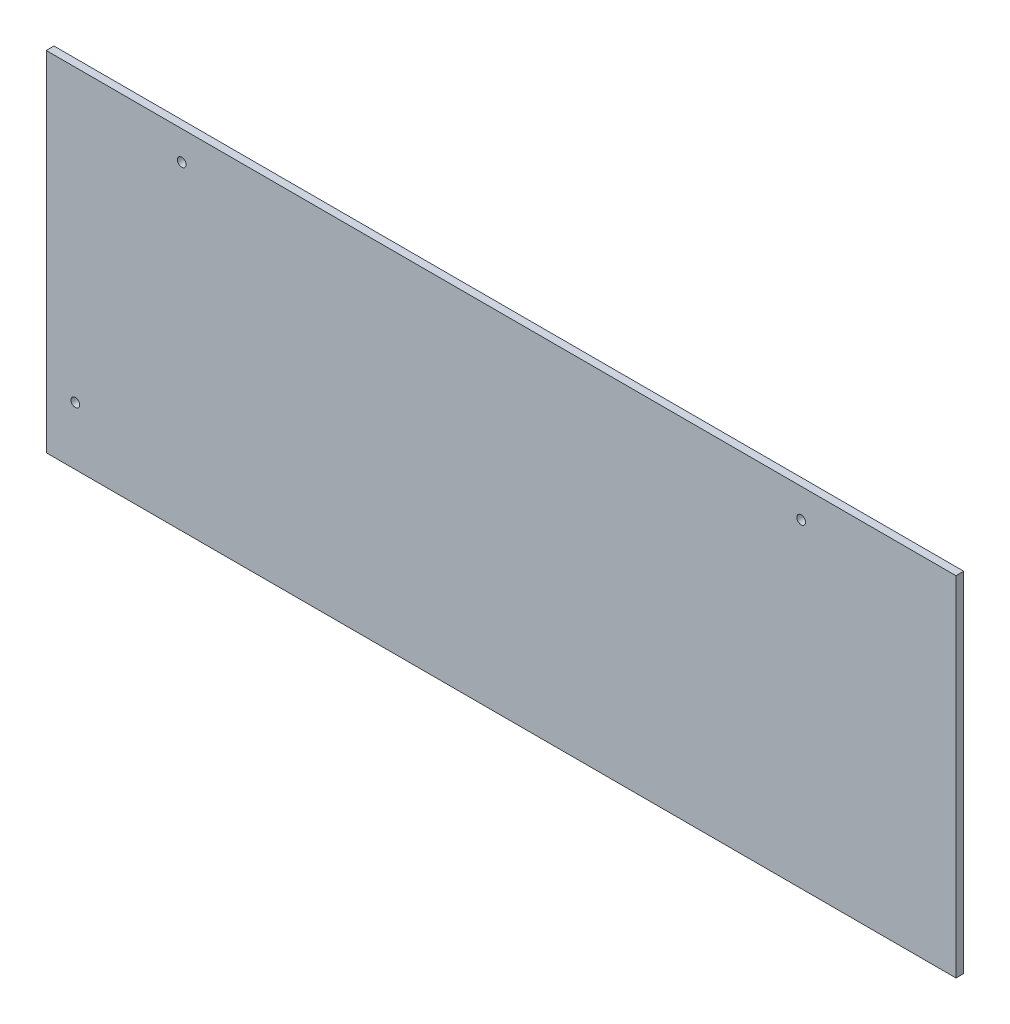
ISO-10303-21;
HEADER;
FILE_DESCRIPTION(('STEP AP214'),'2;1');
FILE_NAME('part.step','',(''),(''),'','','');
FILE_SCHEMA(('AUTOMOTIVE_DESIGN { 1 0 10303 214 1 1 1 1 }'));
ENDSEC;
DATA;
#1=APPLICATION_CONTEXT('core data for automotive mechanical design processes');
#2=APPLICATION_PROTOCOL_DEFINITION('international standard','automotive_design',2000,#1);
#3=PRODUCT_CONTEXT('',#1,'mechanical');
#4=PRODUCT('Part','Part','',(#3));
#5=PRODUCT_RELATED_PRODUCT_CATEGORY('part','',(#4));
#6=PRODUCT_DEFINITION_FORMATION('','',#4);
#7=PRODUCT_DEFINITION_CONTEXT('part definition',#1,'design');
#8=PRODUCT_DEFINITION('design','',#6,#7);
#9=PRODUCT_DEFINITION_SHAPE('','',#8);
#10=(LENGTH_UNIT() NAMED_UNIT(*) SI_UNIT(.MILLI.,.METRE.));
#11=(NAMED_UNIT(*) PLANE_ANGLE_UNIT() SI_UNIT($,.RADIAN.));
#12=(NAMED_UNIT(*) SI_UNIT($,.STERADIAN.) SOLID_ANGLE_UNIT());
#13=UNCERTAINTY_MEASURE_WITH_UNIT(LENGTH_MEASURE(1.E-05),#10,'distance_accuracy_value','');
#14=(GEOMETRIC_REPRESENTATION_CONTEXT(3) GLOBAL_UNCERTAINTY_ASSIGNED_CONTEXT((#13)) GLOBAL_UNIT_ASSIGNED_CONTEXT((#10,
#11,#12)) REPRESENTATION_CONTEXT('',''));
#15=CARTESIAN_POINT('',(0.,0.,0.));
#16=DIRECTION('',(0.,0.,1.));
#17=DIRECTION('',(1.,0.,0.));
#18=AXIS2_PLACEMENT_3D('',#15,#16,#17);
#19=CARTESIAN_POINT('',(-235.,0.,2.));
#20=DIRECTION('',(1.,0.,0.));
#21=DIRECTION('',(0.,1.,0.));
#22=AXIS2_PLACEMENT_3D('',#19,#20,#21);
#23=PLANE('',#22);
#24=DIRECTION('',(0.,-1.,0.));
#25=VECTOR('',#24,1.);
#26=CARTESIAN_POINT('',(-235.,0.,-2.));
#27=LINE('',#26,#25);
#28=CARTESIAN_POINT('',(-235.,0.,-2.));
#29=VERTEX_POINT('',#28);
#30=CARTESIAN_POINT('',(-235.,-180.,-2.));
#31=VERTEX_POINT('',#30);
#32=EDGE_CURVE('E99',#29,#31,#27,.T.);
#33=ORIENTED_EDGE('',*,*,#32,.T.);
#34=DIRECTION('',(0.,0.,-1.));
#35=VECTOR('',#34,1.);
#36=CARTESIAN_POINT('',(-235.,-180.,2.));
#37=LINE('',#36,#35);
#38=CARTESIAN_POINT('',(-235.,-180.,2.));
#39=VERTEX_POINT('',#38);
#40=EDGE_CURVE('E11',#39,#31,#37,.T.);
#41=ORIENTED_EDGE('',*,*,#40,.F.);
#42=DIRECTION('',(0.,-1.,0.));
#43=VECTOR('',#42,1.);
#44=CARTESIAN_POINT('',(-235.,0.,2.));
#45=LINE('',#44,#43);
#46=CARTESIAN_POINT('',(-235.,0.,2.));
#47=VERTEX_POINT('',#46);
#48=EDGE_CURVE('E87',#47,#39,#45,.T.);
#49=ORIENTED_EDGE('',*,*,#48,.F.);
#50=DIRECTION('',(0.,0.,-1.));
#51=VECTOR('',#50,1.);
#52=CARTESIAN_POINT('',(-235.,0.,2.));
#53=LINE('',#52,#51);
#54=EDGE_CURVE('E95',#47,#29,#53,.T.);
#55=ORIENTED_EDGE('',*,*,#54,.T.);
#56=EDGE_LOOP('',(#33,#41,#49,#55));
#57=FACE_BOUND('',#56,.T.);
#58=ADVANCED_FACE('F36',(#57),#23,.F.);
#59=CARTESIAN_POINT('',(-235.,-180.,2.));
#60=DIRECTION('',(0.,1.,0.));
#61=DIRECTION('',(0.,0.,1.));
#62=AXIS2_PLACEMENT_3D('',#59,#60,#61);
#63=PLANE('',#62);
#64=DIRECTION('',(1.,0.,0.));
#65=VECTOR('',#64,1.);
#66=CARTESIAN_POINT('',(-235.,-180.,-2.));
#67=LINE('',#66,#65);
#68=CARTESIAN_POINT('',(235.,-180.,-2.));
#69=VERTEX_POINT('',#68);
#70=EDGE_CURVE('E91',#31,#69,#67,.T.);
#71=ORIENTED_EDGE('',*,*,#70,.T.);
#72=DIRECTION('',(0.,0.,-1.));
#73=VECTOR('',#72,1.);
#74=CARTESIAN_POINT('',(235.,-180.,2.));
#75=LINE('',#74,#73);
#76=CARTESIAN_POINT('',(235.,-180.,2.));
#77=VERTEX_POINT('',#76);
#78=EDGE_CURVE('E44',#77,#69,#75,.T.);
#79=ORIENTED_EDGE('',*,*,#78,.F.);
#80=DIRECTION('',(1.,0.,0.));
#81=VECTOR('',#80,1.);
#82=CARTESIAN_POINT('',(-235.,-180.,2.));
#83=LINE('',#82,#81);
#84=EDGE_CURVE('E82',#39,#77,#83,.T.);
#85=ORIENTED_EDGE('',*,*,#84,.F.);
#86=ORIENTED_EDGE('',*,*,#40,.T.);
#87=EDGE_LOOP('',(#71,#79,#85,#86));
#88=FACE_BOUND('',#87,.T.);
#89=ADVANCED_FACE('F90',(#88),#63,.F.);
#90=CARTESIAN_POINT('',(235.,0.,2.));
#91=DIRECTION('',(-1.,0.,0.));
#92=DIRECTION('',(0.,-1.,0.));
#93=AXIS2_PLACEMENT_3D('',#90,#91,#92);
#94=PLANE('',#93);
#95=DIRECTION('',(0.,1.,0.));
#96=VECTOR('',#95,1.);
#97=CARTESIAN_POINT('',(235.,0.,-2.));
#98=LINE('',#97,#96);
#99=CARTESIAN_POINT('',(235.,0.,-2.));
#100=VERTEX_POINT('',#99);
#101=EDGE_CURVE('E69',#69,#100,#98,.T.);
#102=ORIENTED_EDGE('',*,*,#101,.T.);
#103=DIRECTION('',(0.,0.,-1.));
#104=VECTOR('',#103,1.);
#105=CARTESIAN_POINT('',(235.,0.,2.));
#106=LINE('',#105,#104);
#107=CARTESIAN_POINT('',(235.,0.,2.));
#108=VERTEX_POINT('',#107);
#109=EDGE_CURVE('E92',#108,#100,#106,.T.);
#110=ORIENTED_EDGE('',*,*,#109,.F.);
#111=DIRECTION('',(0.,1.,0.));
#112=VECTOR('',#111,1.);
#113=CARTESIAN_POINT('',(235.,0.,2.));
#114=LINE('',#113,#112);
#115=EDGE_CURVE('E85',#77,#108,#114,.T.);
#116=ORIENTED_EDGE('',*,*,#115,.F.);
#117=ORIENTED_EDGE('',*,*,#78,.T.);
#118=EDGE_LOOP('',(#102,#110,#116,#117));
#119=FACE_BOUND('',#118,.T.);
#120=ADVANCED_FACE('F93',(#119),#94,.F.);
#121=CARTESIAN_POINT('',(-235.,0.,2.));
#122=DIRECTION('',(0.,-1.,0.));
#123=DIRECTION('',(0.,0.,-1.));
#124=AXIS2_PLACEMENT_3D('',#121,#122,#123);
#125=PLANE('',#124);
#126=DIRECTION('',(-1.,0.,0.));
#127=VECTOR('',#126,1.);
#128=CARTESIAN_POINT('',(-235.,0.,-2.));
#129=LINE('',#128,#127);
#130=EDGE_CURVE('E75',#100,#29,#129,.T.);
#131=ORIENTED_EDGE('',*,*,#130,.T.);
#132=ORIENTED_EDGE('',*,*,#54,.F.);
#133=DIRECTION('',(-1.,0.,0.));
#134=VECTOR('',#133,1.);
#135=CARTESIAN_POINT('',(-235.,0.,2.));
#136=LINE('',#135,#134);
#137=EDGE_CURVE('E52',#108,#47,#136,.T.);
#138=ORIENTED_EDGE('',*,*,#137,.F.);
#139=ORIENTED_EDGE('',*,*,#109,.T.);
#140=EDGE_LOOP('',(#131,#132,#138,#139));
#141=FACE_BOUND('',#140,.T.);
#142=ADVANCED_FACE('F107',(#141),#125,.F.);
#143=CARTESIAN_POINT('',(0.,0.,2.));
#144=DIRECTION('',(0.,0.,1.));
#145=DIRECTION('',(1.,0.,0.));
#146=AXIS2_PLACEMENT_3D('',#143,#144,#145);
#147=PLANE('',#146);
#148=CARTESIAN_POINT('',(-220.,-150.,2.));
#149=DIRECTION('',(0.,0.,1.));
#150=DIRECTION('',(1.,0.,0.));
#151=AXIS2_PLACEMENT_3D('',#148,#149,#150);
#152=CIRCLE('',#151,2.25000000000001);
#153=CARTESIAN_POINT('',(-217.75,-150.,2.));
#154=VERTEX_POINT('',#153);
#155=EDGE_CURVE('E125',#154,#154,#152,.T.);
#156=ORIENTED_EDGE('',*,*,#155,.F.);
#157=EDGE_LOOP('',(#156));
#158=FACE_BOUND('',#157,.T.);
#159=CARTESIAN_POINT('',(155.,-15.,2.));
#160=DIRECTION('',(0.,0.,1.));
#161=DIRECTION('',(1.,0.,0.));
#162=AXIS2_PLACEMENT_3D('',#159,#160,#161);
#163=CIRCLE('',#162,2.25000000000001);
#164=CARTESIAN_POINT('',(157.25,-15.,2.));
#165=VERTEX_POINT('',#164);
#166=EDGE_CURVE('E119',#165,#165,#163,.T.);
#167=ORIENTED_EDGE('',*,*,#166,.F.);
#168=EDGE_LOOP('',(#167));
#169=FACE_BOUND('',#168,.T.);
#170=CARTESIAN_POINT('',(-165.,-15.,2.));
#171=DIRECTION('',(0.,0.,1.));
#172=DIRECTION('',(1.,0.,0.));
#173=AXIS2_PLACEMENT_3D('',#170,#171,#172);
#174=CIRCLE('',#173,2.25000000000001);
#175=CARTESIAN_POINT('',(-162.75,-15.,2.));
#176=VERTEX_POINT('',#175);
#177=EDGE_CURVE('E113',#176,#176,#174,.T.);
#178=ORIENTED_EDGE('',*,*,#177,.F.);
#179=EDGE_LOOP('',(#178));
#180=FACE_BOUND('',#179,.T.);
#181=ORIENTED_EDGE('',*,*,#48,.T.);
#182=ORIENTED_EDGE('',*,*,#84,.T.);
#183=ORIENTED_EDGE('',*,*,#115,.T.);
#184=ORIENTED_EDGE('',*,*,#137,.T.);
#185=EDGE_LOOP('',(#181,#182,#183,#184));
#186=FACE_BOUND('',#185,.T.);
#187=ADVANCED_FACE('F83',(#158,#169,#180,#186),#147,.T.);
#188=CARTESIAN_POINT('',(0.,0.,-2.));
#189=DIRECTION('',(0.,0.,1.));
#190=DIRECTION('',(1.,0.,0.));
#191=AXIS2_PLACEMENT_3D('',#188,#189,#190);
#192=PLANE('',#191);
#193=CARTESIAN_POINT('',(-220.,-150.,-2.));
#194=DIRECTION('',(0.,0.,1.));
#195=DIRECTION('',(1.,0.,0.));
#196=AXIS2_PLACEMENT_3D('',#193,#194,#195);
#197=CIRCLE('',#196,2.25000000000001);
#198=CARTESIAN_POINT('',(-217.75,-150.,-2.));
#199=VERTEX_POINT('',#198);
#200=EDGE_CURVE('E122',#199,#199,#197,.T.);
#201=ORIENTED_EDGE('',*,*,#200,.T.);
#202=EDGE_LOOP('',(#201));
#203=FACE_BOUND('',#202,.T.);
#204=CARTESIAN_POINT('',(155.,-15.,-2.));
#205=DIRECTION('',(0.,0.,1.));
#206=DIRECTION('',(1.,0.,0.));
#207=AXIS2_PLACEMENT_3D('',#204,#205,#206);
#208=CIRCLE('',#207,2.25000000000001);
#209=CARTESIAN_POINT('',(157.25,-15.,-2.));
#210=VERTEX_POINT('',#209);
#211=EDGE_CURVE('E116',#210,#210,#208,.T.);
#212=ORIENTED_EDGE('',*,*,#211,.T.);
#213=EDGE_LOOP('',(#212));
#214=FACE_BOUND('',#213,.T.);
#215=CARTESIAN_POINT('',(-165.,-15.,-2.));
#216=DIRECTION('',(0.,0.,1.));
#217=DIRECTION('',(1.,0.,0.));
#218=AXIS2_PLACEMENT_3D('',#215,#216,#217);
#219=CIRCLE('',#218,2.25000000000001);
#220=CARTESIAN_POINT('',(-162.75,-15.,-2.));
#221=VERTEX_POINT('',#220);
#222=EDGE_CURVE('E102',#221,#221,#219,.T.);
#223=ORIENTED_EDGE('',*,*,#222,.T.);
#224=EDGE_LOOP('',(#223));
#225=FACE_BOUND('',#224,.T.);
#226=ORIENTED_EDGE('',*,*,#32,.F.);
#227=ORIENTED_EDGE('',*,*,#130,.F.);
#228=ORIENTED_EDGE('',*,*,#101,.F.);
#229=ORIENTED_EDGE('',*,*,#70,.F.);
#230=EDGE_LOOP('',(#226,#227,#228,#229));
#231=FACE_BOUND('',#230,.T.);
#232=ADVANCED_FACE('F110',(#203,#214,#225,#231),#192,.F.);
#233=CARTESIAN_POINT('',(-165.,-15.,-2.));
#234=DIRECTION('',(0.,0.,1.));
#235=DIRECTION('',(1.,0.,0.));
#236=AXIS2_PLACEMENT_3D('',#233,#234,#235);
#237=CYLINDRICAL_SURFACE('',#236,2.25000000000001);
#238=ORIENTED_EDGE('',*,*,#222,.F.);
#239=EDGE_LOOP('',(#238));
#240=FACE_BOUND('',#239,.T.);
#241=ORIENTED_EDGE('',*,*,#177,.T.);
#242=EDGE_LOOP('',(#241));
#243=FACE_BOUND('',#242,.T.);
#244=ADVANCED_FACE('F147',(#240,#243),#237,.F.);
#245=CARTESIAN_POINT('',(155.,-15.,-2.));
#246=DIRECTION('',(0.,0.,1.));
#247=DIRECTION('',(1.,0.,0.));
#248=AXIS2_PLACEMENT_3D('',#245,#246,#247);
#249=CYLINDRICAL_SURFACE('',#248,2.25000000000001);
#250=ORIENTED_EDGE('',*,*,#211,.F.);
#251=EDGE_LOOP('',(#250));
#252=FACE_BOUND('',#251,.T.);
#253=ORIENTED_EDGE('',*,*,#166,.T.);
#254=EDGE_LOOP('',(#253));
#255=FACE_BOUND('',#254,.T.);
#256=ADVANCED_FACE('F136',(#252,#255),#249,.F.);
#257=CARTESIAN_POINT('',(-220.,-150.,-2.));
#258=DIRECTION('',(0.,0.,1.));
#259=DIRECTION('',(1.,0.,0.));
#260=AXIS2_PLACEMENT_3D('',#257,#258,#259);
#261=CYLINDRICAL_SURFACE('',#260,2.25000000000001);
#262=ORIENTED_EDGE('',*,*,#200,.F.);
#263=EDGE_LOOP('',(#262));
#264=FACE_BOUND('',#263,.T.);
#265=ORIENTED_EDGE('',*,*,#155,.T.);
#266=EDGE_LOOP('',(#265));
#267=FACE_BOUND('',#266,.T.);
#268=ADVANCED_FACE('F133',(#264,#267),#261,.F.);
#269=CLOSED_SHELL('',(#58,#89,#120,#142,#187,#232,#244,#256,#268));
#270=MANIFOLD_SOLID_BREP('B2',#269);
#271=ADVANCED_BREP_SHAPE_REPRESENTATION('',(#18,#270),#14);
#272=SHAPE_DEFINITION_REPRESENTATION(#9,#271);
ENDSEC;
END-ISO-10303-21;
